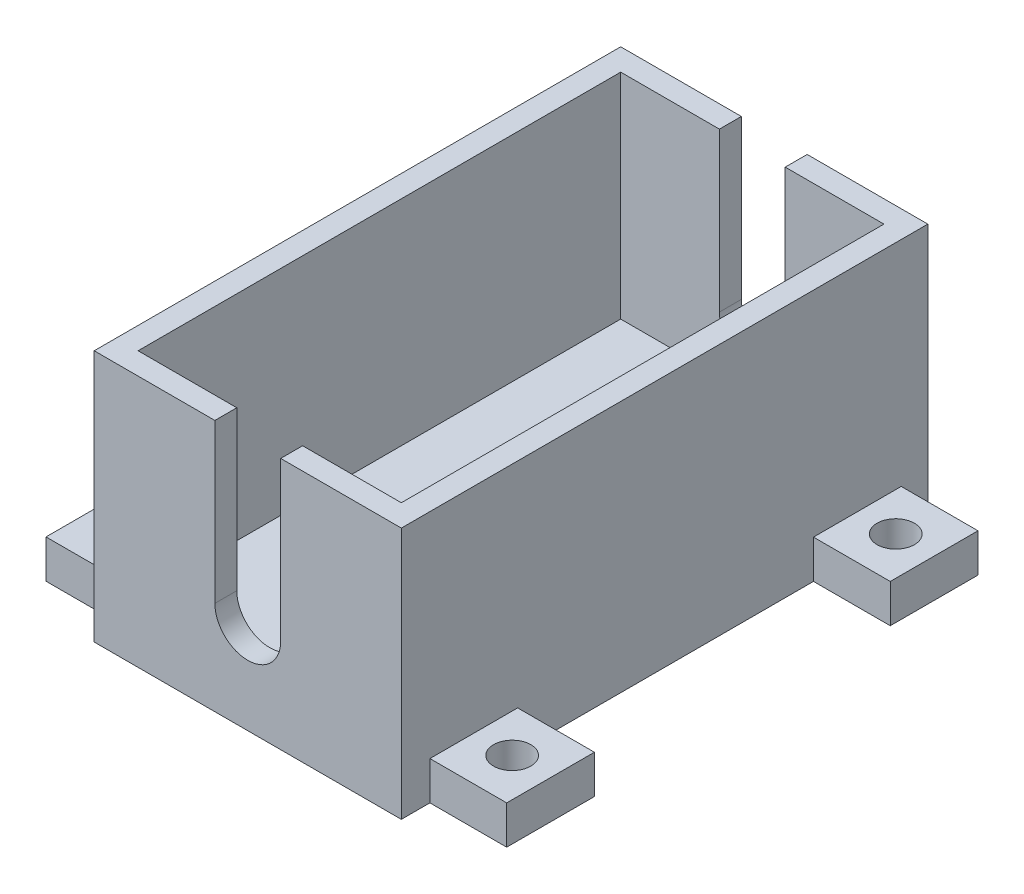
ISO-10303-21;
HEADER;
FILE_DESCRIPTION(('STEP AP214'),'2;1');
FILE_NAME('part.step','',(''),(''),'','','');
FILE_SCHEMA(('AUTOMOTIVE_DESIGN { 1 0 10303 214 1 1 1 1 }'));
ENDSEC;
DATA;
#1=APPLICATION_CONTEXT('core data for automotive mechanical design processes');
#2=APPLICATION_PROTOCOL_DEFINITION('international standard','automotive_design',2000,#1);
#3=PRODUCT_CONTEXT('',#1,'mechanical');
#4=PRODUCT('Part','Part','',(#3));
#5=PRODUCT_RELATED_PRODUCT_CATEGORY('part','',(#4));
#6=PRODUCT_DEFINITION_FORMATION('','',#4);
#7=PRODUCT_DEFINITION_CONTEXT('part definition',#1,'design');
#8=PRODUCT_DEFINITION('design','',#6,#7);
#9=PRODUCT_DEFINITION_SHAPE('','',#8);
#10=(LENGTH_UNIT() NAMED_UNIT(*) SI_UNIT(.MILLI.,.METRE.));
#11=(NAMED_UNIT(*) PLANE_ANGLE_UNIT() SI_UNIT($,.RADIAN.));
#12=(NAMED_UNIT(*) SI_UNIT($,.STERADIAN.) SOLID_ANGLE_UNIT());
#13=UNCERTAINTY_MEASURE_WITH_UNIT(LENGTH_MEASURE(1.E-05),#10,'distance_accuracy_value','');
#14=(GEOMETRIC_REPRESENTATION_CONTEXT(3) GLOBAL_UNCERTAINTY_ASSIGNED_CONTEXT((#13)) GLOBAL_UNIT_ASSIGNED_CONTEXT((#10,
#11,#12)) REPRESENTATION_CONTEXT('',''));
#15=CARTESIAN_POINT('',(0.,0.,0.));
#16=DIRECTION('',(0.,0.,1.));
#17=DIRECTION('',(1.,0.,0.));
#18=AXIS2_PLACEMENT_3D('',#15,#16,#17);
#19=CARTESIAN_POINT('',(0.,23.,0.));
#20=DIRECTION('',(0.,1.,0.));
#21=DIRECTION('',(0.,0.,1.));
#22=AXIS2_PLACEMENT_3D('',#19,#20,#21);
#23=PLANE('',#22);
#24=DIRECTION('',(0.,0.,-1.));
#25=VECTOR('',#24,1.);
#26=CARTESIAN_POINT('',(3.,23.,0.));
#27=LINE('',#26,#25);
#28=CARTESIAN_POINT('',(3.,23.,24.));
#29=VERTEX_POINT('',#28);
#30=CARTESIAN_POINT('',(3.,23.,22.));
#31=VERTEX_POINT('',#30);
#32=EDGE_CURVE('E306',#29,#31,#27,.T.);
#33=ORIENTED_EDGE('',*,*,#32,.F.);
#34=DIRECTION('',(1.,0.,0.));
#35=VECTOR('',#34,1.);
#36=CARTESIAN_POINT('',(-14.,23.,24.));
#37=LINE('',#36,#35);
#38=CARTESIAN_POINT('',(14.,23.,24.));
#39=VERTEX_POINT('',#38);
#40=EDGE_CURVE('E572',#29,#39,#37,.T.);
#41=ORIENTED_EDGE('',*,*,#40,.T.);
#42=DIRECTION('',(0.,0.,-1.));
#43=VECTOR('',#42,1.);
#44=CARTESIAN_POINT('',(14.,23.,-24.));
#45=LINE('',#44,#43);
#46=CARTESIAN_POINT('',(14.,23.,-24.));
#47=VERTEX_POINT('',#46);
#48=EDGE_CURVE('E559',#39,#47,#45,.T.);
#49=ORIENTED_EDGE('',*,*,#48,.T.);
#50=DIRECTION('',(-1.,0.,0.));
#51=VECTOR('',#50,1.);
#52=CARTESIAN_POINT('',(-14.,23.,-24.));
#53=LINE('',#52,#51);
#54=CARTESIAN_POINT('',(3.,23.,-24.));
#55=VERTEX_POINT('',#54);
#56=EDGE_CURVE('E565',#47,#55,#53,.T.);
#57=ORIENTED_EDGE('',*,*,#56,.T.);
#58=CARTESIAN_POINT('',(3.,23.,-22.));
#59=VERTEX_POINT('',#58);
#60=EDGE_CURVE('E302',#59,#55,#27,.T.);
#61=ORIENTED_EDGE('',*,*,#60,.F.);
#62=DIRECTION('',(-1.,0.,0.));
#63=VECTOR('',#62,1.);
#64=CARTESIAN_POINT('',(-12.,23.,-22.));
#65=LINE('',#64,#63);
#66=CARTESIAN_POINT('',(12.,23.,-22.));
#67=VERTEX_POINT('',#66);
#68=EDGE_CURVE('E532',#67,#59,#65,.T.);
#69=ORIENTED_EDGE('',*,*,#68,.F.);
#70=DIRECTION('',(0.,0.,-1.));
#71=VECTOR('',#70,1.);
#72=CARTESIAN_POINT('',(12.,23.,-22.));
#73=LINE('',#72,#71);
#74=CARTESIAN_POINT('',(12.,23.,22.));
#75=VERTEX_POINT('',#74);
#76=EDGE_CURVE('E501',#75,#67,#73,.T.);
#77=ORIENTED_EDGE('',*,*,#76,.F.);
#78=DIRECTION('',(1.,0.,0.));
#79=VECTOR('',#78,1.);
#80=CARTESIAN_POINT('',(-12.,23.,22.));
#81=LINE('',#80,#79);
#82=EDGE_CURVE('E540',#31,#75,#81,.T.);
#83=ORIENTED_EDGE('',*,*,#82,.F.);
#84=EDGE_LOOP('',(#33,#41,#49,#57,#61,#69,#77,#83));
#85=FACE_BOUND('',#84,.T.);
#86=ADVANCED_FACE('F45',(#85),#23,.T.);
#87=CARTESIAN_POINT('',(-14.,23.,-24.));
#88=DIRECTION('',(1.,0.,0.));
#89=DIRECTION('',(0.,0.,-1.));
#90=AXIS2_PLACEMENT_3D('',#87,#88,#89);
#91=PLANE('',#90);
#92=DIRECTION('',(0.,0.,1.));
#93=VECTOR('',#92,1.);
#94=CARTESIAN_POINT('',(-14.,0.,-24.));
#95=LINE('',#94,#93);
#96=CARTESIAN_POINT('',(-14.,0.,-13.5741785754604));
#97=VERTEX_POINT('',#96);
#98=CARTESIAN_POINT('',(-14.,0.,13.3952034265263));
#99=VERTEX_POINT('',#98);
#100=EDGE_CURVE('E590',#97,#99,#95,.T.);
#101=ORIENTED_EDGE('',*,*,#100,.T.);
#102=DIRECTION('',(0.,-1.,0.));
#103=VECTOR('',#102,1.);
#104=CARTESIAN_POINT('',(-14.,3.5,13.3952034265263));
#105=LINE('',#104,#103);
#106=CARTESIAN_POINT('',(-14.,3.5,13.3952034265263));
#107=VERTEX_POINT('',#106);
#108=EDGE_CURVE('E343',#107,#99,#105,.T.);
#109=ORIENTED_EDGE('',*,*,#108,.F.);
#110=DIRECTION('',(0.,0.,1.));
#111=VECTOR('',#110,1.);
#112=CARTESIAN_POINT('',(-14.,3.5,21.3952034265263));
#113=LINE('',#112,#111);
#114=CARTESIAN_POINT('',(-14.,3.5,21.3952034265263));
#115=VERTEX_POINT('',#114);
#116=EDGE_CURVE('E366',#107,#115,#113,.T.);
#117=ORIENTED_EDGE('',*,*,#116,.T.);
#118=DIRECTION('',(0.,-1.,0.));
#119=VECTOR('',#118,1.);
#120=CARTESIAN_POINT('',(-14.,3.5,21.3952034265263));
#121=LINE('',#120,#119);
#122=CARTESIAN_POINT('',(-14.,0.,21.3952034265263));
#123=VERTEX_POINT('',#122);
#124=EDGE_CURVE('E347',#115,#123,#121,.T.);
#125=ORIENTED_EDGE('',*,*,#124,.T.);
#126=CARTESIAN_POINT('',(-14.,0.,24.));
#127=VERTEX_POINT('',#126);
#128=EDGE_CURVE('E585',#123,#127,#95,.T.);
#129=ORIENTED_EDGE('',*,*,#128,.T.);
#130=DIRECTION('',(0.,-1.,0.));
#131=VECTOR('',#130,1.);
#132=CARTESIAN_POINT('',(-14.,23.,24.));
#133=LINE('',#132,#131);
#134=CARTESIAN_POINT('',(-14.,23.,24.));
#135=VERTEX_POINT('',#134);
#136=EDGE_CURVE('E596',#135,#127,#133,.T.);
#137=ORIENTED_EDGE('',*,*,#136,.F.);
#138=DIRECTION('',(0.,0.,1.));
#139=VECTOR('',#138,1.);
#140=CARTESIAN_POINT('',(-14.,23.,-24.));
#141=LINE('',#140,#139);
#142=CARTESIAN_POINT('',(-14.,23.,-24.));
#143=VERTEX_POINT('',#142);
#144=EDGE_CURVE('E569',#143,#135,#141,.T.);
#145=ORIENTED_EDGE('',*,*,#144,.F.);
#146=DIRECTION('',(0.,-1.,0.));
#147=VECTOR('',#146,1.);
#148=CARTESIAN_POINT('',(-14.,23.,-24.));
#149=LINE('',#148,#147);
#150=CARTESIAN_POINT('',(-14.,0.,-24.));
#151=VERTEX_POINT('',#150);
#152=EDGE_CURVE('E600',#143,#151,#149,.T.);
#153=ORIENTED_EDGE('',*,*,#152,.T.);
#154=CARTESIAN_POINT('',(-14.,0.,-21.5741785754604));
#155=VERTEX_POINT('',#154);
#156=EDGE_CURVE('E586',#151,#155,#95,.T.);
#157=ORIENTED_EDGE('',*,*,#156,.T.);
#158=DIRECTION('',(0.,-1.,0.));
#159=VECTOR('',#158,1.);
#160=CARTESIAN_POINT('',(-14.,3.5,-21.5741785754604));
#161=LINE('',#160,#159);
#162=CARTESIAN_POINT('',(-14.,3.5,-21.5741785754604));
#163=VERTEX_POINT('',#162);
#164=EDGE_CURVE('E374',#163,#155,#161,.T.);
#165=ORIENTED_EDGE('',*,*,#164,.F.);
#166=DIRECTION('',(0.,0.,1.));
#167=VECTOR('',#166,1.);
#168=CARTESIAN_POINT('',(-14.,3.5,-13.5741785754604));
#169=LINE('',#168,#167);
#170=CARTESIAN_POINT('',(-14.,3.5,-13.5741785754604));
#171=VERTEX_POINT('',#170);
#172=EDGE_CURVE('E406',#163,#171,#169,.T.);
#173=ORIENTED_EDGE('',*,*,#172,.T.);
#174=DIRECTION('',(0.,-1.,0.));
#175=VECTOR('',#174,1.);
#176=CARTESIAN_POINT('',(-14.,3.5,-13.5741785754604));
#177=LINE('',#176,#175);
#178=EDGE_CURVE('E388',#171,#97,#177,.T.);
#179=ORIENTED_EDGE('',*,*,#178,.T.);
#180=EDGE_LOOP('',(#101,#109,#117,#125,#129,#137,#145,#153,#157,#165,#173,#179));
#181=FACE_BOUND('',#180,.T.);
#182=ADVANCED_FACE('F671',(#181),#91,.F.);
#183=CARTESIAN_POINT('',(14.,23.,-24.));
#184=DIRECTION('',(-1.,0.,0.));
#185=DIRECTION('',(0.,0.,1.));
#186=AXIS2_PLACEMENT_3D('',#183,#184,#185);
#187=PLANE('',#186);
#188=DIRECTION('',(0.,0.,-1.));
#189=VECTOR('',#188,1.);
#190=CARTESIAN_POINT('',(14.,0.,-24.));
#191=LINE('',#190,#189);
#192=CARTESIAN_POINT('',(14.,0.,13.3952034265263));
#193=VERTEX_POINT('',#192);
#194=CARTESIAN_POINT('',(14.,0.,-13.5741785754604));
#195=VERTEX_POINT('',#194);
#196=EDGE_CURVE('E582',#193,#195,#191,.T.);
#197=ORIENTED_EDGE('',*,*,#196,.T.);
#198=DIRECTION('',(0.,-1.,0.));
#199=VECTOR('',#198,1.);
#200=CARTESIAN_POINT('',(14.,3.5,-13.5741785754604));
#201=LINE('',#200,#199);
#202=CARTESIAN_POINT('',(14.,3.5,-13.5741785754604));
#203=VERTEX_POINT('',#202);
#204=EDGE_CURVE('E414',#203,#195,#201,.T.);
#205=ORIENTED_EDGE('',*,*,#204,.F.);
#206=DIRECTION('',(0.,0.,-1.));
#207=VECTOR('',#206,1.);
#208=CARTESIAN_POINT('',(14.,3.5,-21.5741785754604));
#209=LINE('',#208,#207);
#210=CARTESIAN_POINT('',(14.,3.5,-21.5741785754604));
#211=VERTEX_POINT('',#210);
#212=EDGE_CURVE('E448',#203,#211,#209,.T.);
#213=ORIENTED_EDGE('',*,*,#212,.T.);
#214=DIRECTION('',(0.,-1.,0.));
#215=VECTOR('',#214,1.);
#216=CARTESIAN_POINT('',(14.,3.5,-21.5741785754604));
#217=LINE('',#216,#215);
#218=CARTESIAN_POINT('',(14.,0.,-21.5741785754604));
#219=VERTEX_POINT('',#218);
#220=EDGE_CURVE('E429',#211,#219,#217,.T.);
#221=ORIENTED_EDGE('',*,*,#220,.T.);
#222=CARTESIAN_POINT('',(14.,0.,-24.));
#223=VERTEX_POINT('',#222);
#224=EDGE_CURVE('E548',#219,#223,#191,.T.);
#225=ORIENTED_EDGE('',*,*,#224,.T.);
#226=DIRECTION('',(0.,-1.,0.));
#227=VECTOR('',#226,1.);
#228=CARTESIAN_POINT('',(14.,23.,-24.));
#229=LINE('',#228,#227);
#230=EDGE_CURVE('E604',#47,#223,#229,.T.);
#231=ORIENTED_EDGE('',*,*,#230,.F.);
#232=ORIENTED_EDGE('',*,*,#48,.F.);
#233=DIRECTION('',(0.,-1.,0.));
#234=VECTOR('',#233,1.);
#235=CARTESIAN_POINT('',(14.,23.,24.));
#236=LINE('',#235,#234);
#237=CARTESIAN_POINT('',(14.,0.,24.));
#238=VERTEX_POINT('',#237);
#239=EDGE_CURVE('E576',#39,#238,#236,.T.);
#240=ORIENTED_EDGE('',*,*,#239,.T.);
#241=CARTESIAN_POINT('',(14.,0.,21.3952034265263));
#242=VERTEX_POINT('',#241);
#243=EDGE_CURVE('E577',#238,#242,#191,.T.);
#244=ORIENTED_EDGE('',*,*,#243,.T.);
#245=DIRECTION('',(0.,-1.,0.));
#246=VECTOR('',#245,1.);
#247=CARTESIAN_POINT('',(14.,3.5,21.3952034265263));
#248=LINE('',#247,#246);
#249=CARTESIAN_POINT('',(14.,3.5,21.3952034265263));
#250=VERTEX_POINT('',#249);
#251=EDGE_CURVE('E498',#250,#242,#248,.T.);
#252=ORIENTED_EDGE('',*,*,#251,.F.);
#253=DIRECTION('',(0.,0.,-1.));
#254=VECTOR('',#253,1.);
#255=CARTESIAN_POINT('',(14.,3.5,13.3952034265263));
#256=LINE('',#255,#254);
#257=CARTESIAN_POINT('',(14.,3.5,13.3952034265263));
#258=VERTEX_POINT('',#257);
#259=EDGE_CURVE('E470',#250,#258,#256,.T.);
#260=ORIENTED_EDGE('',*,*,#259,.T.);
#261=DIRECTION('',(0.,-1.,0.));
#262=VECTOR('',#261,1.);
#263=CARTESIAN_POINT('',(14.,3.5,13.3952034265263));
#264=LINE('',#263,#262);
#265=EDGE_CURVE('E487',#258,#193,#264,.T.);
#266=ORIENTED_EDGE('',*,*,#265,.T.);
#267=EDGE_LOOP('',(#197,#205,#213,#221,#225,#231,#232,#240,#244,#252,#260,#266));
#268=FACE_BOUND('',#267,.T.);
#269=ADVANCED_FACE('F47',(#268),#187,.F.);
#270=CARTESIAN_POINT('',(-14.,23.,-24.));
#271=DIRECTION('',(0.,0.,1.));
#272=DIRECTION('',(1.,0.,0.));
#273=AXIS2_PLACEMENT_3D('',#270,#271,#272);
#274=PLANE('',#273);
#275=CARTESIAN_POINT('',(0.,8.55678200505768,-24.));
#276=DIRECTION('',(0.,0.,1.));
#277=DIRECTION('',(1.,0.,0.));
#278=AXIS2_PLACEMENT_3D('',#275,#276,#277);
#279=CIRCLE('',#278,3.);
#280=CARTESIAN_POINT('',(-3.,8.55678200505768,-24.));
#281=VERTEX_POINT('',#280);
#282=CARTESIAN_POINT('',(3.,8.55678200505768,-24.));
#283=VERTEX_POINT('',#282);
#284=EDGE_CURVE('E298',#281,#283,#279,.T.);
#285=ORIENTED_EDGE('',*,*,#284,.T.);
#286=DIRECTION('',(0.,1.,0.));
#287=VECTOR('',#286,1.);
#288=CARTESIAN_POINT('',(3.,23.,-24.));
#289=LINE('',#288,#287);
#290=EDGE_CURVE('E305',#283,#55,#289,.T.);
#291=ORIENTED_EDGE('',*,*,#290,.T.);
#292=ORIENTED_EDGE('',*,*,#56,.F.);
#293=ORIENTED_EDGE('',*,*,#230,.T.);
#294=DIRECTION('',(-1.,0.,0.));
#295=VECTOR('',#294,1.);
#296=CARTESIAN_POINT('',(-14.,0.,-24.));
#297=LINE('',#296,#295);
#298=EDGE_CURVE('E581',#223,#151,#297,.T.);
#299=ORIENTED_EDGE('',*,*,#298,.T.);
#300=ORIENTED_EDGE('',*,*,#152,.F.);
#301=CARTESIAN_POINT('',(-3.,23.,-24.));
#302=VERTEX_POINT('',#301);
#303=EDGE_CURVE('E563',#302,#143,#53,.T.);
#304=ORIENTED_EDGE('',*,*,#303,.F.);
#305=DIRECTION('',(0.,-1.,0.));
#306=VECTOR('',#305,1.);
#307=CARTESIAN_POINT('',(-3.,23.,-24.));
#308=LINE('',#307,#306);
#309=EDGE_CURVE('E289',#302,#281,#308,.T.);
#310=ORIENTED_EDGE('',*,*,#309,.T.);
#311=EDGE_LOOP('',(#285,#291,#292,#293,#299,#300,#304,#310));
#312=FACE_BOUND('',#311,.T.);
#313=ADVANCED_FACE('F647',(#312),#274,.F.);
#314=CARTESIAN_POINT('',(-14.,23.,24.));
#315=DIRECTION('',(0.,0.,-1.));
#316=DIRECTION('',(-1.,0.,0.));
#317=AXIS2_PLACEMENT_3D('',#314,#315,#316);
#318=PLANE('',#317);
#319=ORIENTED_EDGE('',*,*,#40,.F.);
#320=DIRECTION('',(0.,1.,0.));
#321=VECTOR('',#320,1.);
#322=CARTESIAN_POINT('',(3.,25.9621033448017,24.));
#323=LINE('',#322,#321);
#324=CARTESIAN_POINT('',(3.,8.55678200505768,24.));
#325=VERTEX_POINT('',#324);
#326=EDGE_CURVE('E264',#325,#29,#323,.T.);
#327=ORIENTED_EDGE('',*,*,#326,.F.);
#328=CARTESIAN_POINT('',(0.,8.55678200505768,24.));
#329=DIRECTION('',(0.,0.,1.));
#330=DIRECTION('',(1.,0.,0.));
#331=AXIS2_PLACEMENT_3D('',#328,#329,#330);
#332=CIRCLE('',#331,3.);
#333=CARTESIAN_POINT('',(-3.,8.55678200505768,24.));
#334=VERTEX_POINT('',#333);
#335=EDGE_CURVE('E257',#334,#325,#332,.T.);
#336=ORIENTED_EDGE('',*,*,#335,.F.);
#337=DIRECTION('',(0.,-1.,0.));
#338=VECTOR('',#337,1.);
#339=CARTESIAN_POINT('',(-3.,25.9621033448017,24.));
#340=LINE('',#339,#338);
#341=CARTESIAN_POINT('',(-3.,23.,24.));
#342=VERTEX_POINT('',#341);
#343=EDGE_CURVE('E267',#342,#334,#340,.T.);
#344=ORIENTED_EDGE('',*,*,#343,.F.);
#345=EDGE_CURVE('E573',#135,#342,#37,.T.);
#346=ORIENTED_EDGE('',*,*,#345,.F.);
#347=ORIENTED_EDGE('',*,*,#136,.T.);
#348=DIRECTION('',(1.,0.,0.));
#349=VECTOR('',#348,1.);
#350=CARTESIAN_POINT('',(-14.,0.,24.));
#351=LINE('',#350,#349);
#352=EDGE_CURVE('E564',#127,#238,#351,.T.);
#353=ORIENTED_EDGE('',*,*,#352,.T.);
#354=ORIENTED_EDGE('',*,*,#239,.F.);
#355=EDGE_LOOP('',(#319,#327,#336,#344,#346,#347,#353,#354));
#356=FACE_BOUND('',#355,.T.);
#357=ADVANCED_FACE('F277',(#356),#318,.F.);
#358=DIRECTION('',(0.,0.,1.));
#359=VECTOR('',#358,1.);
#360=CARTESIAN_POINT('',(-3.,23.,0.));
#361=LINE('',#360,#359);
#362=CARTESIAN_POINT('',(-3.,23.,-22.));
#363=VERTEX_POINT('',#362);
#364=EDGE_CURVE('E69',#302,#363,#361,.T.);
#365=ORIENTED_EDGE('',*,*,#364,.F.);
#366=ORIENTED_EDGE('',*,*,#303,.T.);
#367=ORIENTED_EDGE('',*,*,#144,.T.);
#368=ORIENTED_EDGE('',*,*,#345,.T.);
#369=CARTESIAN_POINT('',(-3.,23.,22.));
#370=VERTEX_POINT('',#369);
#371=EDGE_CURVE('E270',#370,#342,#361,.T.);
#372=ORIENTED_EDGE('',*,*,#371,.F.);
#373=CARTESIAN_POINT('',(-12.,23.,22.));
#374=VERTEX_POINT('',#373);
#375=EDGE_CURVE('E516',#374,#370,#81,.T.);
#376=ORIENTED_EDGE('',*,*,#375,.F.);
#377=DIRECTION('',(0.,0.,1.));
#378=VECTOR('',#377,1.);
#379=CARTESIAN_POINT('',(-12.,23.,-22.));
#380=LINE('',#379,#378);
#381=CARTESIAN_POINT('',(-12.,23.,-22.));
#382=VERTEX_POINT('',#381);
#383=EDGE_CURVE('E536',#382,#374,#380,.T.);
#384=ORIENTED_EDGE('',*,*,#383,.F.);
#385=EDGE_CURVE('E531',#363,#382,#65,.T.);
#386=ORIENTED_EDGE('',*,*,#385,.F.);
#387=EDGE_LOOP('',(#365,#366,#367,#368,#372,#376,#384,#386));
#388=FACE_BOUND('',#387,.T.);
#389=ADVANCED_FACE('F673',(#388),#23,.T.);
#390=CARTESIAN_POINT('',(0.,0.,0.));
#391=DIRECTION('',(0.,1.,0.));
#392=DIRECTION('',(0.,0.,1.));
#393=AXIS2_PLACEMENT_3D('',#390,#391,#392);
#394=PLANE('',#393);
#395=CARTESIAN_POINT('',(17.5,0.,17.3952034265263));
#396=DIRECTION('',(0.,-1.,0.));
#397=DIRECTION('',(0.,0.,-1.));
#398=AXIS2_PLACEMENT_3D('',#395,#396,#397);
#399=CIRCLE('',#398,1.7);
#400=CARTESIAN_POINT('',(17.5,0.,15.6952034265263));
#401=VERTEX_POINT('',#400);
#402=EDGE_CURVE('E331',#401,#401,#399,.T.);
#403=ORIENTED_EDGE('',*,*,#402,.F.);
#404=EDGE_LOOP('',(#403));
#405=FACE_BOUND('',#404,.T.);
#406=CARTESIAN_POINT('',(17.5,0.,-17.5741785754604));
#407=DIRECTION('',(0.,-1.,0.));
#408=DIRECTION('',(0.,0.,-1.));
#409=AXIS2_PLACEMENT_3D('',#406,#407,#408);
#410=CIRCLE('',#409,1.7);
#411=CARTESIAN_POINT('',(17.5,0.,-19.2741785754604));
#412=VERTEX_POINT('',#411);
#413=EDGE_CURVE('E323',#412,#412,#410,.T.);
#414=ORIENTED_EDGE('',*,*,#413,.F.);
#415=EDGE_LOOP('',(#414));
#416=FACE_BOUND('',#415,.T.);
#417=CARTESIAN_POINT('',(-17.5,0.,-17.5741785754604));
#418=DIRECTION('',(0.,-1.,0.));
#419=DIRECTION('',(0.,0.,-1.));
#420=AXIS2_PLACEMENT_3D('',#417,#418,#419);
#421=CIRCLE('',#420,1.7);
#422=CARTESIAN_POINT('',(-17.5,0.,-19.2741785754604));
#423=VERTEX_POINT('',#422);
#424=EDGE_CURVE('E314',#423,#423,#421,.T.);
#425=ORIENTED_EDGE('',*,*,#424,.F.);
#426=EDGE_LOOP('',(#425));
#427=FACE_BOUND('',#426,.T.);
#428=CARTESIAN_POINT('',(-17.5,0.,17.3952034265263));
#429=DIRECTION('',(0.,-1.,0.));
#430=DIRECTION('',(0.,0.,-1.));
#431=AXIS2_PLACEMENT_3D('',#428,#429,#430);
#432=CIRCLE('',#431,1.7);
#433=CARTESIAN_POINT('',(-17.5,0.,15.6952034265263));
#434=VERTEX_POINT('',#433);
#435=EDGE_CURVE('E318',#434,#434,#432,.T.);
#436=ORIENTED_EDGE('',*,*,#435,.F.);
#437=EDGE_LOOP('',(#436));
#438=FACE_BOUND('',#437,.T.);
#439=ORIENTED_EDGE('',*,*,#243,.F.);
#440=ORIENTED_EDGE('',*,*,#352,.F.);
#441=ORIENTED_EDGE('',*,*,#128,.F.);
#442=DIRECTION('',(-1.,0.,0.));
#443=VECTOR('',#442,1.);
#444=CARTESIAN_POINT('',(-21.,0.,21.3952034265263));
#445=LINE('',#444,#443);
#446=CARTESIAN_POINT('',(-21.,0.,21.3952034265263));
#447=VERTEX_POINT('',#446);
#448=EDGE_CURVE('E370',#123,#447,#445,.T.);
#449=ORIENTED_EDGE('',*,*,#448,.T.);
#450=DIRECTION('',(0.,0.,-1.));
#451=VECTOR('',#450,1.);
#452=CARTESIAN_POINT('',(-21.,0.,13.3952034265263));
#453=LINE('',#452,#451);
#454=CARTESIAN_POINT('',(-21.,0.,13.3952034265263));
#455=VERTEX_POINT('',#454);
#456=EDGE_CURVE('E365',#447,#455,#453,.T.);
#457=ORIENTED_EDGE('',*,*,#456,.T.);
#458=DIRECTION('',(1.,0.,0.));
#459=VECTOR('',#458,1.);
#460=CARTESIAN_POINT('',(-14.,0.,13.3952034265263));
#461=LINE('',#460,#459);
#462=EDGE_CURVE('E361',#455,#99,#461,.T.);
#463=ORIENTED_EDGE('',*,*,#462,.T.);
#464=ORIENTED_EDGE('',*,*,#100,.F.);
#465=DIRECTION('',(-1.,0.,0.));
#466=VECTOR('',#465,1.);
#467=CARTESIAN_POINT('',(-21.,0.,-13.5741785754604));
#468=LINE('',#467,#466);
#469=CARTESIAN_POINT('',(-21.,0.,-13.5741785754604));
#470=VERTEX_POINT('',#469);
#471=EDGE_CURVE('E410',#97,#470,#468,.T.);
#472=ORIENTED_EDGE('',*,*,#471,.T.);
#473=DIRECTION('',(0.,0.,-1.));
#474=VECTOR('',#473,1.);
#475=CARTESIAN_POINT('',(-21.,0.,-21.5741785754604));
#476=LINE('',#475,#474);
#477=CARTESIAN_POINT('',(-21.,0.,-21.5741785754604));
#478=VERTEX_POINT('',#477);
#479=EDGE_CURVE('E405',#470,#478,#476,.T.);
#480=ORIENTED_EDGE('',*,*,#479,.T.);
#481=DIRECTION('',(1.,0.,0.));
#482=VECTOR('',#481,1.);
#483=CARTESIAN_POINT('',(-14.,0.,-21.5741785754604));
#484=LINE('',#483,#482);
#485=EDGE_CURVE('E401',#478,#155,#484,.T.);
#486=ORIENTED_EDGE('',*,*,#485,.T.);
#487=ORIENTED_EDGE('',*,*,#156,.F.);
#488=ORIENTED_EDGE('',*,*,#298,.F.);
#489=ORIENTED_EDGE('',*,*,#224,.F.);
#490=DIRECTION('',(1.,0.,0.));
#491=VECTOR('',#490,1.);
#492=CARTESIAN_POINT('',(21.,0.,-21.5741785754604));
#493=LINE('',#492,#491);
#494=CARTESIAN_POINT('',(21.,0.,-21.5741785754604));
#495=VERTEX_POINT('',#494);
#496=EDGE_CURVE('E452',#219,#495,#493,.T.);
#497=ORIENTED_EDGE('',*,*,#496,.T.);
#498=DIRECTION('',(0.,0.,1.));
#499=VECTOR('',#498,1.);
#500=CARTESIAN_POINT('',(21.,0.,-13.5741785754604));
#501=LINE('',#500,#499);
#502=CARTESIAN_POINT('',(21.,0.,-13.5741785754604));
#503=VERTEX_POINT('',#502);
#504=EDGE_CURVE('E447',#495,#503,#501,.T.);
#505=ORIENTED_EDGE('',*,*,#504,.T.);
#506=DIRECTION('',(-1.,0.,0.));
#507=VECTOR('',#506,1.);
#508=CARTESIAN_POINT('',(14.,0.,-13.5741785754604));
#509=LINE('',#508,#507);
#510=EDGE_CURVE('E443',#503,#195,#509,.T.);
#511=ORIENTED_EDGE('',*,*,#510,.T.);
#512=ORIENTED_EDGE('',*,*,#196,.F.);
#513=DIRECTION('',(1.,0.,0.));
#514=VECTOR('',#513,1.);
#515=CARTESIAN_POINT('',(21.,0.,13.3952034265263));
#516=LINE('',#515,#514);
#517=CARTESIAN_POINT('',(21.,0.,13.3952034265263));
#518=VERTEX_POINT('',#517);
#519=EDGE_CURVE('E456',#193,#518,#516,.T.);
#520=ORIENTED_EDGE('',*,*,#519,.T.);
#521=DIRECTION('',(0.,0.,1.));
#522=VECTOR('',#521,1.);
#523=CARTESIAN_POINT('',(21.,0.,21.3952034265263));
#524=LINE('',#523,#522);
#525=CARTESIAN_POINT('',(21.,0.,21.3952034265263));
#526=VERTEX_POINT('',#525);
#527=EDGE_CURVE('E491',#518,#526,#524,.T.);
#528=ORIENTED_EDGE('',*,*,#527,.T.);
#529=DIRECTION('',(-1.,0.,0.));
#530=VECTOR('',#529,1.);
#531=CARTESIAN_POINT('',(14.,0.,21.3952034265263));
#532=LINE('',#531,#530);
#533=EDGE_CURVE('E475',#526,#242,#532,.T.);
#534=ORIENTED_EDGE('',*,*,#533,.T.);
#535=EDGE_LOOP('',(#439,#440,#441,#449,#457,#463,#464,#472,#480,#486,#487,#488,#489,#497,#505,
#511,#512,#520,#528,#534));
#536=FACE_BOUND('',#535,.T.);
#537=ADVANCED_FACE('F684',(#405,#416,#427,#438,#536),#394,.F.);
#538=CARTESIAN_POINT('',(12.,3.5,-22.));
#539=DIRECTION('',(1.,0.,0.));
#540=DIRECTION('',(0.,0.,-1.));
#541=AXIS2_PLACEMENT_3D('',#538,#539,#540);
#542=PLANE('',#541);
#543=ORIENTED_EDGE('',*,*,#76,.T.);
#544=DIRECTION('',(0.,1.,0.));
#545=VECTOR('',#544,1.);
#546=CARTESIAN_POINT('',(12.,3.5,-22.));
#547=LINE('',#546,#545);
#548=CARTESIAN_POINT('',(12.,3.5,-22.));
#549=VERTEX_POINT('',#548);
#550=EDGE_CURVE('E528',#549,#67,#547,.T.);
#551=ORIENTED_EDGE('',*,*,#550,.F.);
#552=DIRECTION('',(0.,0.,-1.));
#553=VECTOR('',#552,1.);
#554=CARTESIAN_POINT('',(12.,3.5,-22.));
#555=LINE('',#554,#553);
#556=CARTESIAN_POINT('',(12.,3.5,22.));
#557=VERTEX_POINT('',#556);
#558=EDGE_CURVE('E511',#557,#549,#555,.T.);
#559=ORIENTED_EDGE('',*,*,#558,.F.);
#560=DIRECTION('',(0.,1.,0.));
#561=VECTOR('',#560,1.);
#562=CARTESIAN_POINT('',(12.,3.5,22.));
#563=LINE('',#562,#561);
#564=EDGE_CURVE('E544',#557,#75,#563,.T.);
#565=ORIENTED_EDGE('',*,*,#564,.T.);
#566=EDGE_LOOP('',(#543,#551,#559,#565));
#567=FACE_BOUND('',#566,.T.);
#568=ADVANCED_FACE('F654',(#567),#542,.F.);
#569=CARTESIAN_POINT('',(-12.,3.5,22.));
#570=DIRECTION('',(0.,0.,1.));
#571=DIRECTION('',(1.,0.,0.));
#572=AXIS2_PLACEMENT_3D('',#569,#570,#571);
#573=PLANE('',#572);
#574=CARTESIAN_POINT('',(0.,8.55678200505768,22.));
#575=DIRECTION('',(0.,0.,1.));
#576=DIRECTION('',(1.,0.,0.));
#577=AXIS2_PLACEMENT_3D('',#574,#575,#576);
#578=CIRCLE('',#577,3.);
#579=CARTESIAN_POINT('',(-3.,8.55678200505768,22.));
#580=VERTEX_POINT('',#579);
#581=CARTESIAN_POINT('',(3.,8.55678200505768,22.));
#582=VERTEX_POINT('',#581);
#583=EDGE_CURVE('E260',#580,#582,#578,.T.);
#584=ORIENTED_EDGE('',*,*,#583,.T.);
#585=DIRECTION('',(0.,1.,0.));
#586=VECTOR('',#585,1.);
#587=CARTESIAN_POINT('',(3.,3.5,22.));
#588=LINE('',#587,#586);
#589=EDGE_CURVE('E310',#582,#31,#588,.T.);
#590=ORIENTED_EDGE('',*,*,#589,.T.);
#591=ORIENTED_EDGE('',*,*,#82,.T.);
#592=ORIENTED_EDGE('',*,*,#564,.F.);
#593=DIRECTION('',(1.,0.,0.));
#594=VECTOR('',#593,1.);
#595=CARTESIAN_POINT('',(-12.,3.5,22.));
#596=LINE('',#595,#594);
#597=CARTESIAN_POINT('',(-12.,3.5,22.));
#598=VERTEX_POINT('',#597);
#599=EDGE_CURVE('E524',#598,#557,#596,.T.);
#600=ORIENTED_EDGE('',*,*,#599,.F.);
#601=DIRECTION('',(0.,1.,0.));
#602=VECTOR('',#601,1.);
#603=CARTESIAN_POINT('',(-12.,3.5,22.));
#604=LINE('',#603,#602);
#605=EDGE_CURVE('E549',#598,#374,#604,.T.);
#606=ORIENTED_EDGE('',*,*,#605,.T.);
#607=ORIENTED_EDGE('',*,*,#375,.T.);
#608=DIRECTION('',(0.,-1.,0.));
#609=VECTOR('',#608,1.);
#610=CARTESIAN_POINT('',(-3.,3.5,22.));
#611=LINE('',#610,#609);
#612=EDGE_CURVE('E293',#370,#580,#611,.T.);
#613=ORIENTED_EDGE('',*,*,#612,.T.);
#614=EDGE_LOOP('',(#584,#590,#591,#592,#600,#606,#607,#613));
#615=FACE_BOUND('',#614,.T.);
#616=ADVANCED_FACE('F656',(#615),#573,.F.);
#617=CARTESIAN_POINT('',(-12.,3.5,-22.));
#618=DIRECTION('',(-1.,0.,0.));
#619=DIRECTION('',(0.,0.,1.));
#620=AXIS2_PLACEMENT_3D('',#617,#618,#619);
#621=PLANE('',#620);
#622=ORIENTED_EDGE('',*,*,#383,.T.);
#623=ORIENTED_EDGE('',*,*,#605,.F.);
#624=DIRECTION('',(0.,0.,1.));
#625=VECTOR('',#624,1.);
#626=CARTESIAN_POINT('',(-12.,3.5,-22.));
#627=LINE('',#626,#625);
#628=CARTESIAN_POINT('',(-12.,3.5,-22.));
#629=VERTEX_POINT('',#628);
#630=EDGE_CURVE('E520',#629,#598,#627,.T.);
#631=ORIENTED_EDGE('',*,*,#630,.F.);
#632=DIRECTION('',(0.,1.,0.));
#633=VECTOR('',#632,1.);
#634=CARTESIAN_POINT('',(-12.,3.5,-22.));
#635=LINE('',#634,#633);
#636=EDGE_CURVE('E552',#629,#382,#635,.T.);
#637=ORIENTED_EDGE('',*,*,#636,.T.);
#638=EDGE_LOOP('',(#622,#623,#631,#637));
#639=FACE_BOUND('',#638,.T.);
#640=ADVANCED_FACE('F808',(#639),#621,.F.);
#641=CARTESIAN_POINT('',(-12.,3.5,-22.));
#642=DIRECTION('',(0.,0.,-1.));
#643=DIRECTION('',(-1.,0.,0.));
#644=AXIS2_PLACEMENT_3D('',#641,#642,#643);
#645=PLANE('',#644);
#646=ORIENTED_EDGE('',*,*,#68,.T.);
#647=DIRECTION('',(0.,-1.,0.));
#648=VECTOR('',#647,1.);
#649=CARTESIAN_POINT('',(3.,3.5,-22.));
#650=LINE('',#649,#648);
#651=CARTESIAN_POINT('',(3.,8.55678200505768,-22.));
#652=VERTEX_POINT('',#651);
#653=EDGE_CURVE('E11',#59,#652,#650,.T.);
#654=ORIENTED_EDGE('',*,*,#653,.T.);
#655=CARTESIAN_POINT('',(0.,8.55678200505768,-22.));
#656=DIRECTION('',(0.,0.,-1.));
#657=DIRECTION('',(-1.,0.,0.));
#658=AXIS2_PLACEMENT_3D('',#655,#656,#657);
#659=CIRCLE('',#658,3.);
#660=CARTESIAN_POINT('',(-3.,8.55678200505768,-22.));
#661=VERTEX_POINT('',#660);
#662=EDGE_CURVE('E54',#652,#661,#659,.T.);
#663=ORIENTED_EDGE('',*,*,#662,.T.);
#664=DIRECTION('',(0.,1.,0.));
#665=VECTOR('',#664,1.);
#666=CARTESIAN_POINT('',(-3.,3.5,-22.));
#667=LINE('',#666,#665);
#668=EDGE_CURVE('E608',#661,#363,#667,.T.);
#669=ORIENTED_EDGE('',*,*,#668,.T.);
#670=ORIENTED_EDGE('',*,*,#385,.T.);
#671=ORIENTED_EDGE('',*,*,#636,.F.);
#672=DIRECTION('',(-1.,0.,0.));
#673=VECTOR('',#672,1.);
#674=CARTESIAN_POINT('',(-12.,3.5,-22.));
#675=LINE('',#674,#673);
#676=EDGE_CURVE('E515',#549,#629,#675,.T.);
#677=ORIENTED_EDGE('',*,*,#676,.F.);
#678=ORIENTED_EDGE('',*,*,#550,.T.);
#679=EDGE_LOOP('',(#646,#654,#663,#669,#670,#671,#677,#678));
#680=FACE_BOUND('',#679,.T.);
#681=ADVANCED_FACE('F613',(#680),#645,.F.);
#682=CARTESIAN_POINT('',(0.,3.5,0.));
#683=DIRECTION('',(0.,1.,0.));
#684=DIRECTION('',(0.,0.,1.));
#685=AXIS2_PLACEMENT_3D('',#682,#683,#684);
#686=PLANE('',#685);
#687=ORIENTED_EDGE('',*,*,#558,.T.);
#688=ORIENTED_EDGE('',*,*,#676,.T.);
#689=ORIENTED_EDGE('',*,*,#630,.T.);
#690=ORIENTED_EDGE('',*,*,#599,.T.);
#691=EDGE_LOOP('',(#687,#688,#689,#690));
#692=FACE_BOUND('',#691,.T.);
#693=ADVANCED_FACE('F798',(#692),#686,.T.);
#694=CARTESIAN_POINT('',(14.,3.5,21.3952034265263));
#695=DIRECTION('',(0.,0.,1.));
#696=DIRECTION('',(1.,0.,0.));
#697=AXIS2_PLACEMENT_3D('',#694,#695,#696);
#698=PLANE('',#697);
#699=ORIENTED_EDGE('',*,*,#533,.F.);
#700=DIRECTION('',(0.,-1.,0.));
#701=VECTOR('',#700,1.);
#702=CARTESIAN_POINT('',(21.,3.5,21.3952034265263));
#703=LINE('',#702,#701);
#704=CARTESIAN_POINT('',(21.,3.5,21.3952034265263));
#705=VERTEX_POINT('',#704);
#706=EDGE_CURVE('E502',#705,#526,#703,.T.);
#707=ORIENTED_EDGE('',*,*,#706,.F.);
#708=DIRECTION('',(-1.,0.,0.));
#709=VECTOR('',#708,1.);
#710=CARTESIAN_POINT('',(14.,3.5,21.3952034265263));
#711=LINE('',#710,#709);
#712=EDGE_CURVE('E483',#705,#250,#711,.T.);
#713=ORIENTED_EDGE('',*,*,#712,.T.);
#714=ORIENTED_EDGE('',*,*,#251,.T.);
#715=EDGE_LOOP('',(#699,#707,#713,#714));
#716=FACE_BOUND('',#715,.T.);
#717=ADVANCED_FACE('F703',(#716),#698,.T.);
#718=CARTESIAN_POINT('',(21.,3.5,21.3952034265263));
#719=DIRECTION('',(1.,0.,0.));
#720=DIRECTION('',(0.,0.,-1.));
#721=AXIS2_PLACEMENT_3D('',#718,#719,#720);
#722=PLANE('',#721);
#723=ORIENTED_EDGE('',*,*,#527,.F.);
#724=DIRECTION('',(0.,-1.,0.));
#725=VECTOR('',#724,1.);
#726=CARTESIAN_POINT('',(21.,3.5,13.3952034265263));
#727=LINE('',#726,#725);
#728=CARTESIAN_POINT('',(21.,3.5,13.3952034265263));
#729=VERTEX_POINT('',#728);
#730=EDGE_CURVE('E505',#729,#518,#727,.T.);
#731=ORIENTED_EDGE('',*,*,#730,.F.);
#732=DIRECTION('',(0.,0.,1.));
#733=VECTOR('',#732,1.);
#734=CARTESIAN_POINT('',(21.,3.5,21.3952034265263));
#735=LINE('',#734,#733);
#736=EDGE_CURVE('E479',#729,#705,#735,.T.);
#737=ORIENTED_EDGE('',*,*,#736,.T.);
#738=ORIENTED_EDGE('',*,*,#706,.T.);
#739=EDGE_LOOP('',(#723,#731,#737,#738));
#740=FACE_BOUND('',#739,.T.);
#741=ADVANCED_FACE('F797',(#740),#722,.T.);
#742=CARTESIAN_POINT('',(21.,3.5,13.3952034265263));
#743=DIRECTION('',(0.,0.,-1.));
#744=DIRECTION('',(-1.,0.,0.));
#745=AXIS2_PLACEMENT_3D('',#742,#743,#744);
#746=PLANE('',#745);
#747=ORIENTED_EDGE('',*,*,#519,.F.);
#748=ORIENTED_EDGE('',*,*,#265,.F.);
#749=DIRECTION('',(1.,0.,0.));
#750=VECTOR('',#749,1.);
#751=CARTESIAN_POINT('',(21.,3.5,13.3952034265263));
#752=LINE('',#751,#750);
#753=EDGE_CURVE('E474',#258,#729,#752,.T.);
#754=ORIENTED_EDGE('',*,*,#753,.T.);
#755=ORIENTED_EDGE('',*,*,#730,.T.);
#756=EDGE_LOOP('',(#747,#748,#754,#755));
#757=FACE_BOUND('',#756,.T.);
#758=ADVANCED_FACE('F710',(#757),#746,.T.);
#759=CARTESIAN_POINT('',(0.,3.5,0.));
#760=DIRECTION('',(0.,1.,0.));
#761=DIRECTION('',(0.,0.,1.));
#762=AXIS2_PLACEMENT_3D('',#759,#760,#761);
#763=PLANE('',#762);
#764=CARTESIAN_POINT('',(17.5,3.5,17.3952034265263));
#765=DIRECTION('',(0.,-1.,0.));
#766=DIRECTION('',(0.,0.,-1.));
#767=AXIS2_PLACEMENT_3D('',#764,#765,#766);
#768=CIRCLE('',#767,1.7);
#769=CARTESIAN_POINT('',(17.5,3.5,15.6952034265263));
#770=VERTEX_POINT('',#769);
#771=EDGE_CURVE('E335',#770,#770,#768,.T.);
#772=ORIENTED_EDGE('',*,*,#771,.T.);
#773=EDGE_LOOP('',(#772));
#774=FACE_BOUND('',#773,.T.);
#775=ORIENTED_EDGE('',*,*,#259,.F.);
#776=ORIENTED_EDGE('',*,*,#712,.F.);
#777=ORIENTED_EDGE('',*,*,#736,.F.);
#778=ORIENTED_EDGE('',*,*,#753,.F.);
#779=EDGE_LOOP('',(#775,#776,#777,#778));
#780=FACE_BOUND('',#779,.T.);
#781=ADVANCED_FACE('F707',(#774,#780),#763,.T.);
#782=CARTESIAN_POINT('',(14.,3.5,-13.5741785754604));
#783=DIRECTION('',(0.,0.,1.));
#784=DIRECTION('',(1.,0.,0.));
#785=AXIS2_PLACEMENT_3D('',#782,#783,#784);
#786=PLANE('',#785);
#787=ORIENTED_EDGE('',*,*,#510,.F.);
#788=DIRECTION('',(0.,-1.,0.));
#789=VECTOR('',#788,1.);
#790=CARTESIAN_POINT('',(21.,3.5,-13.5741785754604));
#791=LINE('',#790,#789);
#792=CARTESIAN_POINT('',(21.,3.5,-13.5741785754604));
#793=VERTEX_POINT('',#792);
#794=EDGE_CURVE('E437',#793,#503,#791,.T.);
#795=ORIENTED_EDGE('',*,*,#794,.F.);
#796=DIRECTION('',(-1.,0.,0.));
#797=VECTOR('',#796,1.);
#798=CARTESIAN_POINT('',(14.,3.5,-13.5741785754604));
#799=LINE('',#798,#797);
#800=EDGE_CURVE('E433',#793,#203,#799,.T.);
#801=ORIENTED_EDGE('',*,*,#800,.T.);
#802=ORIENTED_EDGE('',*,*,#204,.T.);
#803=EDGE_LOOP('',(#787,#795,#801,#802));
#804=FACE_BOUND('',#803,.T.);
#805=ADVANCED_FACE('F716',(#804),#786,.T.);
#806=CARTESIAN_POINT('',(21.,3.5,-13.5741785754604));
#807=DIRECTION('',(1.,0.,0.));
#808=DIRECTION('',(0.,0.,-1.));
#809=AXIS2_PLACEMENT_3D('',#806,#807,#808);
#810=PLANE('',#809);
#811=ORIENTED_EDGE('',*,*,#504,.F.);
#812=DIRECTION('',(0.,-1.,0.));
#813=VECTOR('',#812,1.);
#814=CARTESIAN_POINT('',(21.,3.5,-21.5741785754604));
#815=LINE('',#814,#813);
#816=CARTESIAN_POINT('',(21.,3.5,-21.5741785754604));
#817=VERTEX_POINT('',#816);
#818=EDGE_CURVE('E434',#817,#495,#815,.T.);
#819=ORIENTED_EDGE('',*,*,#818,.F.);
#820=DIRECTION('',(0.,0.,1.));
#821=VECTOR('',#820,1.);
#822=CARTESIAN_POINT('',(21.,3.5,-13.5741785754604));
#823=LINE('',#822,#821);
#824=EDGE_CURVE('E460',#817,#793,#823,.T.);
#825=ORIENTED_EDGE('',*,*,#824,.T.);
#826=ORIENTED_EDGE('',*,*,#794,.T.);
#827=EDGE_LOOP('',(#811,#819,#825,#826));
#828=FACE_BOUND('',#827,.T.);
#829=ADVANCED_FACE('F783',(#828),#810,.T.);
#830=CARTESIAN_POINT('',(21.,3.5,-21.5741785754604));
#831=DIRECTION('',(0.,0.,-1.));
#832=DIRECTION('',(-1.,0.,0.));
#833=AXIS2_PLACEMENT_3D('',#830,#831,#832);
#834=PLANE('',#833);
#835=ORIENTED_EDGE('',*,*,#496,.F.);
#836=ORIENTED_EDGE('',*,*,#220,.F.);
#837=DIRECTION('',(1.,0.,0.));
#838=VECTOR('',#837,1.);
#839=CARTESIAN_POINT('',(21.,3.5,-21.5741785754604));
#840=LINE('',#839,#838);
#841=EDGE_CURVE('E464',#211,#817,#840,.T.);
#842=ORIENTED_EDGE('',*,*,#841,.T.);
#843=ORIENTED_EDGE('',*,*,#818,.T.);
#844=EDGE_LOOP('',(#835,#836,#842,#843));
#845=FACE_BOUND('',#844,.T.);
#846=ADVANCED_FACE('F726',(#845),#834,.T.);
#847=CARTESIAN_POINT('',(0.,3.5,0.));
#848=DIRECTION('',(0.,1.,0.));
#849=DIRECTION('',(0.,0.,1.));
#850=AXIS2_PLACEMENT_3D('',#847,#848,#849);
#851=PLANE('',#850);
#852=CARTESIAN_POINT('',(17.5,3.5,-17.5741785754604));
#853=DIRECTION('',(0.,-1.,0.));
#854=DIRECTION('',(0.,0.,-1.));
#855=AXIS2_PLACEMENT_3D('',#852,#853,#854);
#856=CIRCLE('',#855,1.7);
#857=CARTESIAN_POINT('',(17.5,3.5,-19.2741785754604));
#858=VERTEX_POINT('',#857);
#859=EDGE_CURVE('E327',#858,#858,#856,.T.);
#860=ORIENTED_EDGE('',*,*,#859,.T.);
#861=EDGE_LOOP('',(#860));
#862=FACE_BOUND('',#861,.T.);
#863=ORIENTED_EDGE('',*,*,#212,.F.);
#864=ORIENTED_EDGE('',*,*,#800,.F.);
#865=ORIENTED_EDGE('',*,*,#824,.F.);
#866=ORIENTED_EDGE('',*,*,#841,.F.);
#867=EDGE_LOOP('',(#863,#864,#865,#866));
#868=FACE_BOUND('',#867,.T.);
#869=ADVANCED_FACE('F722',(#862,#868),#851,.T.);
#870=CARTESIAN_POINT('',(-14.,3.5,-21.5741785754604));
#871=DIRECTION('',(0.,0.,-1.));
#872=DIRECTION('',(-1.,0.,0.));
#873=AXIS2_PLACEMENT_3D('',#870,#871,#872);
#874=PLANE('',#873);
#875=ORIENTED_EDGE('',*,*,#485,.F.);
#876=DIRECTION('',(0.,-1.,0.));
#877=VECTOR('',#876,1.);
#878=CARTESIAN_POINT('',(-21.,3.5,-21.5741785754604));
#879=LINE('',#878,#877);
#880=CARTESIAN_POINT('',(-21.,3.5,-21.5741785754604));
#881=VERTEX_POINT('',#880);
#882=EDGE_CURVE('E396',#881,#478,#879,.T.);
#883=ORIENTED_EDGE('',*,*,#882,.F.);
#884=DIRECTION('',(1.,0.,0.));
#885=VECTOR('',#884,1.);
#886=CARTESIAN_POINT('',(-14.,3.5,-21.5741785754604));
#887=LINE('',#886,#885);
#888=EDGE_CURVE('E392',#881,#163,#887,.T.);
#889=ORIENTED_EDGE('',*,*,#888,.T.);
#890=ORIENTED_EDGE('',*,*,#164,.T.);
#891=EDGE_LOOP('',(#875,#883,#889,#890));
#892=FACE_BOUND('',#891,.T.);
#893=ADVANCED_FACE('F730',(#892),#874,.T.);
#894=CARTESIAN_POINT('',(-21.,3.5,-21.5741785754604));
#895=DIRECTION('',(-1.,0.,0.));
#896=DIRECTION('',(0.,0.,1.));
#897=AXIS2_PLACEMENT_3D('',#894,#895,#896);
#898=PLANE('',#897);
#899=ORIENTED_EDGE('',*,*,#479,.F.);
#900=DIRECTION('',(0.,-1.,0.));
#901=VECTOR('',#900,1.);
#902=CARTESIAN_POINT('',(-21.,3.5,-13.5741785754604));
#903=LINE('',#902,#901);
#904=CARTESIAN_POINT('',(-21.,3.5,-13.5741785754604));
#905=VERTEX_POINT('',#904);
#906=EDGE_CURVE('E393',#905,#470,#903,.T.);
#907=ORIENTED_EDGE('',*,*,#906,.F.);
#908=DIRECTION('',(0.,0.,-1.));
#909=VECTOR('',#908,1.);
#910=CARTESIAN_POINT('',(-21.,3.5,-21.5741785754604));
#911=LINE('',#910,#909);
#912=EDGE_CURVE('E418',#905,#881,#911,.T.);
#913=ORIENTED_EDGE('',*,*,#912,.T.);
#914=ORIENTED_EDGE('',*,*,#882,.T.);
#915=EDGE_LOOP('',(#899,#907,#913,#914));
#916=FACE_BOUND('',#915,.T.);
#917=ADVANCED_FACE('F772',(#916),#898,.T.);
#918=CARTESIAN_POINT('',(-21.,3.5,-13.5741785754604));
#919=DIRECTION('',(0.,0.,1.));
#920=DIRECTION('',(1.,0.,0.));
#921=AXIS2_PLACEMENT_3D('',#918,#919,#920);
#922=PLANE('',#921);
#923=ORIENTED_EDGE('',*,*,#471,.F.);
#924=ORIENTED_EDGE('',*,*,#178,.F.);
#925=DIRECTION('',(-1.,0.,0.));
#926=VECTOR('',#925,1.);
#927=CARTESIAN_POINT('',(-21.,3.5,-13.5741785754604));
#928=LINE('',#927,#926);
#929=EDGE_CURVE('E422',#171,#905,#928,.T.);
#930=ORIENTED_EDGE('',*,*,#929,.T.);
#931=ORIENTED_EDGE('',*,*,#906,.T.);
#932=EDGE_LOOP('',(#923,#924,#930,#931));
#933=FACE_BOUND('',#932,.T.);
#934=ADVANCED_FACE('F737',(#933),#922,.T.);
#935=CARTESIAN_POINT('',(0.,3.5,0.));
#936=DIRECTION('',(0.,1.,0.));
#937=DIRECTION('',(0.,0.,1.));
#938=AXIS2_PLACEMENT_3D('',#935,#936,#937);
#939=PLANE('',#938);
#940=CARTESIAN_POINT('',(-17.5,3.5,-17.5741785754604));
#941=DIRECTION('',(0.,-1.,0.));
#942=DIRECTION('',(0.,0.,-1.));
#943=AXIS2_PLACEMENT_3D('',#940,#941,#942);
#944=CIRCLE('',#943,1.7);
#945=CARTESIAN_POINT('',(-17.5,3.5,-19.2741785754604));
#946=VERTEX_POINT('',#945);
#947=EDGE_CURVE('E319',#946,#946,#944,.T.);
#948=ORIENTED_EDGE('',*,*,#947,.T.);
#949=EDGE_LOOP('',(#948));
#950=FACE_BOUND('',#949,.T.);
#951=ORIENTED_EDGE('',*,*,#172,.F.);
#952=ORIENTED_EDGE('',*,*,#888,.F.);
#953=ORIENTED_EDGE('',*,*,#912,.F.);
#954=ORIENTED_EDGE('',*,*,#929,.F.);
#955=EDGE_LOOP('',(#951,#952,#953,#954));
#956=FACE_BOUND('',#955,.T.);
#957=ADVANCED_FACE('F734',(#950,#956),#939,.T.);
#958=CARTESIAN_POINT('',(-14.,3.5,13.3952034265263));
#959=DIRECTION('',(0.,0.,-1.));
#960=DIRECTION('',(-1.,0.,0.));
#961=AXIS2_PLACEMENT_3D('',#958,#959,#960);
#962=PLANE('',#961);
#963=ORIENTED_EDGE('',*,*,#462,.F.);
#964=DIRECTION('',(0.,-1.,0.));
#965=VECTOR('',#964,1.);
#966=CARTESIAN_POINT('',(-21.,3.5,13.3952034265263));
#967=LINE('',#966,#965);
#968=CARTESIAN_POINT('',(-21.,3.5,13.3952034265263));
#969=VERTEX_POINT('',#968);
#970=EDGE_CURVE('E355',#969,#455,#967,.T.);
#971=ORIENTED_EDGE('',*,*,#970,.F.);
#972=DIRECTION('',(1.,0.,0.));
#973=VECTOR('',#972,1.);
#974=CARTESIAN_POINT('',(-14.,3.5,13.3952034265263));
#975=LINE('',#974,#973);
#976=EDGE_CURVE('E351',#969,#107,#975,.T.);
#977=ORIENTED_EDGE('',*,*,#976,.T.);
#978=ORIENTED_EDGE('',*,*,#108,.T.);
#979=EDGE_LOOP('',(#963,#971,#977,#978));
#980=FACE_BOUND('',#979,.T.);
#981=ADVANCED_FACE('F743',(#980),#962,.T.);
#982=CARTESIAN_POINT('',(-21.,3.5,13.3952034265263));
#983=DIRECTION('',(-1.,0.,0.));
#984=DIRECTION('',(0.,0.,1.));
#985=AXIS2_PLACEMENT_3D('',#982,#983,#984);
#986=PLANE('',#985);
#987=ORIENTED_EDGE('',*,*,#456,.F.);
#988=DIRECTION('',(0.,-1.,0.));
#989=VECTOR('',#988,1.);
#990=CARTESIAN_POINT('',(-21.,3.5,21.3952034265263));
#991=LINE('',#990,#989);
#992=CARTESIAN_POINT('',(-21.,3.5,21.3952034265263));
#993=VERTEX_POINT('',#992);
#994=EDGE_CURVE('E352',#993,#447,#991,.T.);
#995=ORIENTED_EDGE('',*,*,#994,.F.);
#996=DIRECTION('',(0.,0.,-1.));
#997=VECTOR('',#996,1.);
#998=CARTESIAN_POINT('',(-21.,3.5,13.3952034265263));
#999=LINE('',#998,#997);
#1000=EDGE_CURVE('E378',#993,#969,#999,.T.);
#1001=ORIENTED_EDGE('',*,*,#1000,.T.);
#1002=ORIENTED_EDGE('',*,*,#970,.T.);
#1003=EDGE_LOOP('',(#987,#995,#1001,#1002));
#1004=FACE_BOUND('',#1003,.T.);
#1005=ADVANCED_FACE('F755',(#1004),#986,.T.);
#1006=CARTESIAN_POINT('',(-21.,3.5,21.3952034265263));
#1007=DIRECTION('',(0.,0.,1.));
#1008=DIRECTION('',(1.,0.,0.));
#1009=AXIS2_PLACEMENT_3D('',#1006,#1007,#1008);
#1010=PLANE('',#1009);
#1011=ORIENTED_EDGE('',*,*,#448,.F.);
#1012=ORIENTED_EDGE('',*,*,#124,.F.);
#1013=DIRECTION('',(-1.,0.,0.));
#1014=VECTOR('',#1013,1.);
#1015=CARTESIAN_POINT('',(-21.,3.5,21.3952034265263));
#1016=LINE('',#1015,#1014);
#1017=EDGE_CURVE('E382',#115,#993,#1016,.T.);
#1018=ORIENTED_EDGE('',*,*,#1017,.T.);
#1019=ORIENTED_EDGE('',*,*,#994,.T.);
#1020=EDGE_LOOP('',(#1011,#1012,#1018,#1019));
#1021=FACE_BOUND('',#1020,.T.);
#1022=ADVANCED_FACE('F753',(#1021),#1010,.T.);
#1023=CARTESIAN_POINT('',(0.,3.5,0.));
#1024=DIRECTION('',(0.,1.,0.));
#1025=DIRECTION('',(0.,0.,1.));
#1026=AXIS2_PLACEMENT_3D('',#1023,#1024,#1025);
#1027=PLANE('',#1026);
#1028=CARTESIAN_POINT('',(-17.5,3.5,17.3952034265263));
#1029=DIRECTION('',(0.,-1.,0.));
#1030=DIRECTION('',(0.,0.,-1.));
#1031=AXIS2_PLACEMENT_3D('',#1028,#1029,#1030);
#1032=CIRCLE('',#1031,1.7);
#1033=CARTESIAN_POINT('',(-17.5,3.5,15.6952034265263));
#1034=VERTEX_POINT('',#1033);
#1035=EDGE_CURVE('E339',#1034,#1034,#1032,.T.);
#1036=ORIENTED_EDGE('',*,*,#1035,.T.);
#1037=EDGE_LOOP('',(#1036));
#1038=FACE_BOUND('',#1037,.T.);
#1039=ORIENTED_EDGE('',*,*,#116,.F.);
#1040=ORIENTED_EDGE('',*,*,#976,.F.);
#1041=ORIENTED_EDGE('',*,*,#1000,.F.);
#1042=ORIENTED_EDGE('',*,*,#1017,.F.);
#1043=EDGE_LOOP('',(#1039,#1040,#1041,#1042));
#1044=FACE_BOUND('',#1043,.T.);
#1045=ADVANCED_FACE('F749',(#1038,#1044),#1027,.T.);
#1046=CARTESIAN_POINT('',(-17.5,3.5,17.3952034265263));
#1047=DIRECTION('',(0.,-1.,0.));
#1048=DIRECTION('',(0.,0.,-1.));
#1049=AXIS2_PLACEMENT_3D('',#1046,#1047,#1048);
#1050=CYLINDRICAL_SURFACE('',#1049,1.7);
#1051=ORIENTED_EDGE('',*,*,#1035,.F.);
#1052=EDGE_LOOP('',(#1051));
#1053=FACE_BOUND('',#1052,.T.);
#1054=ORIENTED_EDGE('',*,*,#435,.T.);
#1055=EDGE_LOOP('',(#1054));
#1056=FACE_BOUND('',#1055,.T.);
#1057=ADVANCED_FACE('F768',(#1053,#1056),#1050,.F.);
#1058=CARTESIAN_POINT('',(-17.5,3.5,-17.5741785754604));
#1059=DIRECTION('',(0.,-1.,0.));
#1060=DIRECTION('',(0.,0.,-1.));
#1061=AXIS2_PLACEMENT_3D('',#1058,#1059,#1060);
#1062=CYLINDRICAL_SURFACE('',#1061,1.7);
#1063=ORIENTED_EDGE('',*,*,#947,.F.);
#1064=EDGE_LOOP('',(#1063));
#1065=FACE_BOUND('',#1064,.T.);
#1066=ORIENTED_EDGE('',*,*,#424,.T.);
#1067=EDGE_LOOP('',(#1066));
#1068=FACE_BOUND('',#1067,.T.);
#1069=ADVANCED_FACE('F921',(#1065,#1068),#1062,.F.);
#1070=CARTESIAN_POINT('',(17.5,3.5,-17.5741785754604));
#1071=DIRECTION('',(0.,-1.,0.));
#1072=DIRECTION('',(0.,0.,-1.));
#1073=AXIS2_PLACEMENT_3D('',#1070,#1071,#1072);
#1074=CYLINDRICAL_SURFACE('',#1073,1.7);
#1075=ORIENTED_EDGE('',*,*,#859,.F.);
#1076=EDGE_LOOP('',(#1075));
#1077=FACE_BOUND('',#1076,.T.);
#1078=ORIENTED_EDGE('',*,*,#413,.T.);
#1079=EDGE_LOOP('',(#1078));
#1080=FACE_BOUND('',#1079,.T.);
#1081=ADVANCED_FACE('F930',(#1077,#1080),#1074,.F.);
#1082=CARTESIAN_POINT('',(17.5,3.5,17.3952034265263));
#1083=DIRECTION('',(0.,-1.,0.));
#1084=DIRECTION('',(0.,0.,-1.));
#1085=AXIS2_PLACEMENT_3D('',#1082,#1083,#1084);
#1086=CYLINDRICAL_SURFACE('',#1085,1.7);
#1087=ORIENTED_EDGE('',*,*,#771,.F.);
#1088=EDGE_LOOP('',(#1087));
#1089=FACE_BOUND('',#1088,.T.);
#1090=ORIENTED_EDGE('',*,*,#402,.T.);
#1091=EDGE_LOOP('',(#1090));
#1092=FACE_BOUND('',#1091,.T.);
#1093=ADVANCED_FACE('F940',(#1089,#1092),#1086,.F.);
#1094=CARTESIAN_POINT('',(-3.,25.9621033448017,-26.));
#1095=DIRECTION('',(-1.,0.,0.));
#1096=DIRECTION('',(0.,-1.,0.));
#1097=AXIS2_PLACEMENT_3D('',#1094,#1095,#1096);
#1098=PLANE('',#1097);
#1099=ORIENTED_EDGE('',*,*,#364,.T.);
#1100=ORIENTED_EDGE('',*,*,#668,.F.);
#1101=DIRECTION('',(0.,0.,1.));
#1102=VECTOR('',#1101,1.);
#1103=CARTESIAN_POINT('',(-3.,8.55678200505768,-26.));
#1104=LINE('',#1103,#1102);
#1105=EDGE_CURVE('E263',#281,#661,#1104,.T.);
#1106=ORIENTED_EDGE('',*,*,#1105,.F.);
#1107=ORIENTED_EDGE('',*,*,#309,.F.);
#1108=EDGE_LOOP('',(#1099,#1100,#1106,#1107));
#1109=FACE_BOUND('',#1108,.T.);
#1110=ADVANCED_FACE('F667',(#1109),#1098,.F.);
#1111=CARTESIAN_POINT('',(0.,8.55678200505768,-26.));
#1112=DIRECTION('',(0.,0.,1.));
#1113=DIRECTION('',(1.,0.,0.));
#1114=AXIS2_PLACEMENT_3D('',#1111,#1112,#1113);
#1115=CYLINDRICAL_SURFACE('',#1114,3.);
#1116=ORIENTED_EDGE('',*,*,#1105,.T.);
#1117=ORIENTED_EDGE('',*,*,#662,.F.);
#1118=DIRECTION('',(0.,0.,1.));
#1119=VECTOR('',#1118,1.);
#1120=CARTESIAN_POINT('',(3.,8.55678200505768,-26.));
#1121=LINE('',#1120,#1119);
#1122=EDGE_CURVE('E285',#283,#652,#1121,.T.);
#1123=ORIENTED_EDGE('',*,*,#1122,.F.);
#1124=ORIENTED_EDGE('',*,*,#284,.F.);
#1125=EDGE_LOOP('',(#1116,#1117,#1123,#1124));
#1126=FACE_BOUND('',#1125,.T.);
#1127=ADVANCED_FACE('F619',(#1126),#1115,.F.);
#1128=CARTESIAN_POINT('',(3.,25.9621033448017,-26.));
#1129=DIRECTION('',(1.,0.,0.));
#1130=DIRECTION('',(0.,1.,0.));
#1131=AXIS2_PLACEMENT_3D('',#1128,#1129,#1130);
#1132=PLANE('',#1131);
#1133=ORIENTED_EDGE('',*,*,#1122,.T.);
#1134=ORIENTED_EDGE('',*,*,#653,.F.);
#1135=ORIENTED_EDGE('',*,*,#60,.T.);
#1136=ORIENTED_EDGE('',*,*,#290,.F.);
#1137=EDGE_LOOP('',(#1133,#1134,#1135,#1136));
#1138=FACE_BOUND('',#1137,.T.);
#1139=ADVANCED_FACE('F622',(#1138),#1132,.F.);
#1140=EDGE_CURVE('E61',#580,#334,#1104,.T.);
#1141=ORIENTED_EDGE('',*,*,#1140,.T.);
#1142=ORIENTED_EDGE('',*,*,#335,.T.);
#1143=EDGE_CURVE('E283',#582,#325,#1121,.T.);
#1144=ORIENTED_EDGE('',*,*,#1143,.F.);
#1145=ORIENTED_EDGE('',*,*,#583,.F.);
#1146=EDGE_LOOP('',(#1141,#1142,#1144,#1145));
#1147=FACE_BOUND('',#1146,.T.);
#1148=ADVANCED_FACE('F254',(#1147),#1115,.F.);
#1149=ORIENTED_EDGE('',*,*,#32,.T.);
#1150=ORIENTED_EDGE('',*,*,#589,.F.);
#1151=ORIENTED_EDGE('',*,*,#1143,.T.);
#1152=ORIENTED_EDGE('',*,*,#326,.T.);
#1153=EDGE_LOOP('',(#1149,#1150,#1151,#1152));
#1154=FACE_BOUND('',#1153,.T.);
#1155=ADVANCED_FACE('F659',(#1154),#1132,.F.);
#1156=ORIENTED_EDGE('',*,*,#371,.T.);
#1157=ORIENTED_EDGE('',*,*,#343,.T.);
#1158=ORIENTED_EDGE('',*,*,#1140,.F.);
#1159=ORIENTED_EDGE('',*,*,#612,.F.);
#1160=EDGE_LOOP('',(#1156,#1157,#1158,#1159));
#1161=FACE_BOUND('',#1160,.T.);
#1162=ADVANCED_FACE('F268',(#1161),#1098,.F.);
#1163=CLOSED_SHELL('',(#86,#182,#269,#313,#357,#389,#537,#568,#616,#640,#681,#693,#717,#741,
#758,#781,#805,#829,#846,#869,#893,#917,#934,#957,#981,#1005,#1022,#1045,#1057,#1069,#1081,
#1093,#1110,#1127,#1139,#1148,#1155,#1162));
#1164=MANIFOLD_SOLID_BREP('B2',#1163);
#1165=ADVANCED_BREP_SHAPE_REPRESENTATION('',(#18,#1164),#14);
#1166=SHAPE_DEFINITION_REPRESENTATION(#9,#1165);
ENDSEC;
END-ISO-10303-21;
